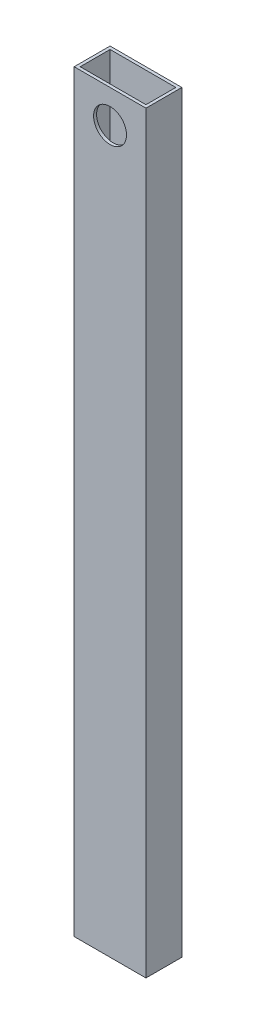
ISO-10303-21;
HEADER;
FILE_DESCRIPTION(('STEP AP214'),'2;1');
FILE_NAME('part.step','',(''),(''),'','','');
FILE_SCHEMA(('AUTOMOTIVE_DESIGN { 1 0 10303 214 1 1 1 1 }'));
ENDSEC;
DATA;
#1=APPLICATION_CONTEXT('core data for automotive mechanical design processes');
#2=APPLICATION_PROTOCOL_DEFINITION('international standard','automotive_design',2000,#1);
#3=PRODUCT_CONTEXT('',#1,'mechanical');
#4=PRODUCT('Part','Part','',(#3));
#5=PRODUCT_RELATED_PRODUCT_CATEGORY('part','',(#4));
#6=PRODUCT_DEFINITION_FORMATION('','',#4);
#7=PRODUCT_DEFINITION_CONTEXT('part definition',#1,'design');
#8=PRODUCT_DEFINITION('design','',#6,#7);
#9=PRODUCT_DEFINITION_SHAPE('','',#8);
#10=(LENGTH_UNIT() NAMED_UNIT(*) SI_UNIT(.MILLI.,.METRE.));
#11=(NAMED_UNIT(*) PLANE_ANGLE_UNIT() SI_UNIT($,.RADIAN.));
#12=(NAMED_UNIT(*) SI_UNIT($,.STERADIAN.) SOLID_ANGLE_UNIT());
#13=UNCERTAINTY_MEASURE_WITH_UNIT(LENGTH_MEASURE(1.E-05),#10,'distance_accuracy_value','');
#14=(GEOMETRIC_REPRESENTATION_CONTEXT(3) GLOBAL_UNCERTAINTY_ASSIGNED_CONTEXT((#13)) GLOBAL_UNIT_ASSIGNED_CONTEXT((#10,
#11,#12)) REPRESENTATION_CONTEXT('',''));
#15=CARTESIAN_POINT('',(0.,0.,0.));
#16=DIRECTION('',(0.,0.,1.));
#17=DIRECTION('',(1.,0.,0.));
#18=AXIS2_PLACEMENT_3D('',#15,#16,#17);
#19=CARTESIAN_POINT('',(38.1,-290.,-19.05));
#20=DIRECTION('',(1.,0.,0.));
#21=DIRECTION('',(0.,0.,-1.));
#22=AXIS2_PLACEMENT_3D('',#19,#20,#21);
#23=PLANE('',#22);
#24=DIRECTION('',(0.,1.,0.));
#25=VECTOR('',#24,1.);
#26=CARTESIAN_POINT('',(38.1,-290.,-19.05));
#27=LINE('',#26,#25);
#28=CARTESIAN_POINT('',(38.1,-290.,-19.05));
#29=VERTEX_POINT('',#28);
#30=CARTESIAN_POINT('',(38.1,510.,-19.05));
#31=VERTEX_POINT('',#30);
#32=EDGE_CURVE('E87',#29,#31,#27,.T.);
#33=ORIENTED_EDGE('',*,*,#32,.T.);
#34=DIRECTION('',(0.,0.,-1.));
#35=VECTOR('',#34,1.);
#36=CARTESIAN_POINT('',(38.1,510.,-19.05));
#37=LINE('',#36,#35);
#38=CARTESIAN_POINT('',(38.1,510.,19.05));
#39=VERTEX_POINT('',#38);
#40=EDGE_CURVE('E181',#39,#31,#37,.T.);
#41=ORIENTED_EDGE('',*,*,#40,.F.);
#42=DIRECTION('',(0.,1.,0.));
#43=VECTOR('',#42,1.);
#44=CARTESIAN_POINT('',(38.1,-290.,19.05));
#45=LINE('',#44,#43);
#46=CARTESIAN_POINT('',(38.1,-290.,19.05));
#47=VERTEX_POINT('',#46);
#48=EDGE_CURVE('E12',#47,#39,#45,.T.);
#49=ORIENTED_EDGE('',*,*,#48,.F.);
#50=DIRECTION('',(0.,0.,-1.));
#51=VECTOR('',#50,1.);
#52=CARTESIAN_POINT('',(38.1,-290.,-19.05));
#53=LINE('',#52,#51);
#54=EDGE_CURVE('E200',#47,#29,#53,.T.);
#55=ORIENTED_EDGE('',*,*,#54,.T.);
#56=EDGE_LOOP('',(#33,#41,#49,#55));
#57=FACE_BOUND('',#56,.T.);
#58=ADVANCED_FACE('F84',(#57),#23,.T.);
#59=CARTESIAN_POINT('',(-38.1,-290.,19.05));
#60=DIRECTION('',(0.,0.,1.));
#61=DIRECTION('',(1.,0.,0.));
#62=AXIS2_PLACEMENT_3D('',#59,#60,#61);
#63=PLANE('',#62);
#64=CARTESIAN_POINT('',(0.,475.,19.05));
#65=DIRECTION('',(0.,0.,1.));
#66=DIRECTION('',(1.,0.,0.));
#67=AXIS2_PLACEMENT_3D('',#64,#65,#66);
#68=CIRCLE('',#67,17.5);
#69=CARTESIAN_POINT('',(17.5,475.,19.05));
#70=VERTEX_POINT('',#69);
#71=EDGE_CURVE('E407',#70,#70,#68,.T.);
#72=ORIENTED_EDGE('',*,*,#71,.F.);
#73=EDGE_LOOP('',(#72));
#74=FACE_BOUND('',#73,.T.);
#75=ORIENTED_EDGE('',*,*,#48,.T.);
#76=DIRECTION('',(1.,0.,0.));
#77=VECTOR('',#76,1.);
#78=CARTESIAN_POINT('',(-38.1,510.,19.05));
#79=LINE('',#78,#77);
#80=CARTESIAN_POINT('',(-38.1,510.,19.05));
#81=VERTEX_POINT('',#80);
#82=EDGE_CURVE('E190',#81,#39,#79,.T.);
#83=ORIENTED_EDGE('',*,*,#82,.F.);
#84=DIRECTION('',(0.,1.,0.));
#85=VECTOR('',#84,1.);
#86=CARTESIAN_POINT('',(-38.1,-290.,19.05));
#87=LINE('',#86,#85);
#88=CARTESIAN_POINT('',(-38.1,-290.,19.05));
#89=VERTEX_POINT('',#88);
#90=EDGE_CURVE('E92',#89,#81,#87,.T.);
#91=ORIENTED_EDGE('',*,*,#90,.F.);
#92=DIRECTION('',(1.,0.,0.));
#93=VECTOR('',#92,1.);
#94=CARTESIAN_POINT('',(-38.1,-290.,19.05));
#95=LINE('',#94,#93);
#96=EDGE_CURVE('E211',#89,#47,#95,.T.);
#97=ORIENTED_EDGE('',*,*,#96,.T.);
#98=EDGE_LOOP('',(#75,#83,#91,#97));
#99=FACE_BOUND('',#98,.T.);
#100=ADVANCED_FACE('F223',(#74,#99),#63,.T.);
#101=CARTESIAN_POINT('',(-38.1,-290.,-19.05));
#102=DIRECTION('',(-1.,0.,0.));
#103=DIRECTION('',(0.,0.,1.));
#104=AXIS2_PLACEMENT_3D('',#101,#102,#103);
#105=PLANE('',#104);
#106=ORIENTED_EDGE('',*,*,#90,.T.);
#107=DIRECTION('',(0.,0.,1.));
#108=VECTOR('',#107,1.);
#109=CARTESIAN_POINT('',(-38.1,510.,-19.05));
#110=LINE('',#109,#108);
#111=CARTESIAN_POINT('',(-38.1,510.,-19.05));
#112=VERTEX_POINT('',#111);
#113=EDGE_CURVE('E187',#112,#81,#110,.T.);
#114=ORIENTED_EDGE('',*,*,#113,.F.);
#115=DIRECTION('',(0.,1.,0.));
#116=VECTOR('',#115,1.);
#117=CARTESIAN_POINT('',(-38.1,-290.,-19.05));
#118=LINE('',#117,#116);
#119=CARTESIAN_POINT('',(-38.1,-290.,-19.05));
#120=VERTEX_POINT('',#119);
#121=EDGE_CURVE('E214',#120,#112,#118,.T.);
#122=ORIENTED_EDGE('',*,*,#121,.F.);
#123=DIRECTION('',(0.,0.,1.));
#124=VECTOR('',#123,1.);
#125=CARTESIAN_POINT('',(-38.1,-290.,-19.05));
#126=LINE('',#125,#124);
#127=EDGE_CURVE('E208',#120,#89,#126,.T.);
#128=ORIENTED_EDGE('',*,*,#127,.T.);
#129=EDGE_LOOP('',(#106,#114,#122,#128));
#130=FACE_BOUND('',#129,.T.);
#131=ADVANCED_FACE('F229',(#130),#105,.T.);
#132=CARTESIAN_POINT('',(-38.1,-290.,-19.05));
#133=DIRECTION('',(0.,0.,-1.));
#134=DIRECTION('',(-1.,0.,0.));
#135=AXIS2_PLACEMENT_3D('',#132,#133,#134);
#136=PLANE('',#135);
#137=CARTESIAN_POINT('',(0.,-75.,-19.05));
#138=DIRECTION('',(0.,0.,-1.));
#139=DIRECTION('',(-1.,0.,0.));
#140=AXIS2_PLACEMENT_3D('',#137,#138,#139);
#141=CIRCLE('',#140,17.5);
#142=CARTESIAN_POINT('',(-17.5,-75.,-19.05));
#143=VERTEX_POINT('',#142);
#144=EDGE_CURVE('E410',#143,#143,#141,.T.);
#145=ORIENTED_EDGE('',*,*,#144,.F.);
#146=EDGE_LOOP('',(#145));
#147=FACE_BOUND('',#146,.T.);
#148=CARTESIAN_POINT('',(20.,-25.,-19.05));
#149=DIRECTION('',(0.,0.,-1.));
#150=DIRECTION('',(-1.,0.,0.));
#151=AXIS2_PLACEMENT_3D('',#148,#149,#150);
#152=CIRCLE('',#151,6.);
#153=CARTESIAN_POINT('',(14.,-25.,-19.05));
#154=VERTEX_POINT('',#153);
#155=EDGE_CURVE('E401',#154,#154,#152,.T.);
#156=ORIENTED_EDGE('',*,*,#155,.F.);
#157=EDGE_LOOP('',(#156));
#158=FACE_BOUND('',#157,.T.);
#159=CARTESIAN_POINT('',(-20.,-275.,-19.05));
#160=DIRECTION('',(0.,0.,-1.));
#161=DIRECTION('',(-1.,0.,0.));
#162=AXIS2_PLACEMENT_3D('',#159,#160,#161);
#163=CIRCLE('',#162,6.);
#164=CARTESIAN_POINT('',(-26.,-275.,-19.05));
#165=VERTEX_POINT('',#164);
#166=EDGE_CURVE('E395',#165,#165,#163,.T.);
#167=ORIENTED_EDGE('',*,*,#166,.F.);
#168=EDGE_LOOP('',(#167));
#169=FACE_BOUND('',#168,.T.);
#170=CARTESIAN_POINT('',(20.,-275.,-19.05));
#171=DIRECTION('',(0.,0.,-1.));
#172=DIRECTION('',(-1.,0.,0.));
#173=AXIS2_PLACEMENT_3D('',#170,#171,#172);
#174=CIRCLE('',#173,6.);
#175=CARTESIAN_POINT('',(14.,-275.,-19.05));
#176=VERTEX_POINT('',#175);
#177=EDGE_CURVE('E387',#176,#176,#174,.T.);
#178=ORIENTED_EDGE('',*,*,#177,.F.);
#179=EDGE_LOOP('',(#178));
#180=FACE_BOUND('',#179,.T.);
#181=CARTESIAN_POINT('',(-20.,-25.,-19.05));
#182=DIRECTION('',(0.,0.,-1.));
#183=DIRECTION('',(-1.,0.,0.));
#184=AXIS2_PLACEMENT_3D('',#181,#182,#183);
#185=CIRCLE('',#184,6.);
#186=CARTESIAN_POINT('',(-26.,-25.,-19.05));
#187=VERTEX_POINT('',#186);
#188=EDGE_CURVE('E382',#187,#187,#185,.T.);
#189=ORIENTED_EDGE('',*,*,#188,.F.);
#190=EDGE_LOOP('',(#189));
#191=FACE_BOUND('',#190,.T.);
#192=ORIENTED_EDGE('',*,*,#121,.T.);
#193=DIRECTION('',(-1.,0.,0.));
#194=VECTOR('',#193,1.);
#195=CARTESIAN_POINT('',(-38.1,510.,-19.05));
#196=LINE('',#195,#194);
#197=EDGE_CURVE('E184',#31,#112,#196,.T.);
#198=ORIENTED_EDGE('',*,*,#197,.F.);
#199=ORIENTED_EDGE('',*,*,#32,.F.);
#200=DIRECTION('',(-1.,0.,0.));
#201=VECTOR('',#200,1.);
#202=CARTESIAN_POINT('',(-38.1,-290.,-19.05));
#203=LINE('',#202,#201);
#204=EDGE_CURVE('E205',#29,#120,#203,.T.);
#205=ORIENTED_EDGE('',*,*,#204,.T.);
#206=EDGE_LOOP('',(#192,#198,#199,#205));
#207=FACE_BOUND('',#206,.T.);
#208=ADVANCED_FACE('F218',(#147,#158,#169,#180,#191,#207),#136,.T.);
#209=CARTESIAN_POINT('',(0.,-290.,0.));
#210=DIRECTION('',(0.,1.,0.));
#211=DIRECTION('',(0.,0.,1.));
#212=AXIS2_PLACEMENT_3D('',#209,#210,#211);
#213=PLANE('',#212);
#214=DIRECTION('',(1.,0.,0.));
#215=VECTOR('',#214,1.);
#216=CARTESIAN_POINT('',(-38.1,-290.,15.875));
#217=LINE('',#216,#215);
#218=CARTESIAN_POINT('',(-34.925,-290.,15.875));
#219=VERTEX_POINT('',#218);
#220=CARTESIAN_POINT('',(34.925,-290.,15.875));
#221=VERTEX_POINT('',#220);
#222=EDGE_CURVE('E161',#219,#221,#217,.T.);
#223=ORIENTED_EDGE('',*,*,#222,.T.);
#224=DIRECTION('',(0.,0.,-1.));
#225=VECTOR('',#224,1.);
#226=CARTESIAN_POINT('',(34.925,-290.,-19.05));
#227=LINE('',#226,#225);
#228=CARTESIAN_POINT('',(34.925,-290.,-15.875));
#229=VERTEX_POINT('',#228);
#230=EDGE_CURVE('E193',#221,#229,#227,.T.);
#231=ORIENTED_EDGE('',*,*,#230,.T.);
#232=DIRECTION('',(-1.,0.,0.));
#233=VECTOR('',#232,1.);
#234=CARTESIAN_POINT('',(-38.1,-290.,-15.875));
#235=LINE('',#234,#233);
#236=CARTESIAN_POINT('',(-34.925,-290.,-15.875));
#237=VERTEX_POINT('',#236);
#238=EDGE_CURVE('E156',#229,#237,#235,.T.);
#239=ORIENTED_EDGE('',*,*,#238,.T.);
#240=DIRECTION('',(0.,0.,1.));
#241=VECTOR('',#240,1.);
#242=CARTESIAN_POINT('',(-34.925,-290.,-19.05));
#243=LINE('',#242,#241);
#244=EDGE_CURVE('E100',#237,#219,#243,.T.);
#245=ORIENTED_EDGE('',*,*,#244,.T.);
#246=EDGE_LOOP('',(#223,#231,#239,#245));
#247=FACE_BOUND('',#246,.T.);
#248=ORIENTED_EDGE('',*,*,#54,.F.);
#249=ORIENTED_EDGE('',*,*,#96,.F.);
#250=ORIENTED_EDGE('',*,*,#127,.F.);
#251=ORIENTED_EDGE('',*,*,#204,.F.);
#252=EDGE_LOOP('',(#248,#249,#250,#251));
#253=FACE_BOUND('',#252,.T.);
#254=ADVANCED_FACE('F227',(#247,#253),#213,.F.);
#255=CARTESIAN_POINT('',(34.925,-290.,-19.05));
#256=DIRECTION('',(1.,0.,0.));
#257=DIRECTION('',(0.,0.,-1.));
#258=AXIS2_PLACEMENT_3D('',#255,#256,#257);
#259=PLANE('',#258);
#260=DIRECTION('',(0.,1.,0.));
#261=VECTOR('',#260,1.);
#262=CARTESIAN_POINT('',(34.925,-290.,15.875));
#263=LINE('',#262,#261);
#264=CARTESIAN_POINT('',(34.925,510.,15.875));
#265=VERTEX_POINT('',#264);
#266=EDGE_CURVE('E166',#221,#265,#263,.T.);
#267=ORIENTED_EDGE('',*,*,#266,.T.);
#268=DIRECTION('',(0.,0.,-1.));
#269=VECTOR('',#268,1.);
#270=CARTESIAN_POINT('',(34.925,510.,-19.05));
#271=LINE('',#270,#269);
#272=CARTESIAN_POINT('',(34.925,510.,-15.875));
#273=VERTEX_POINT('',#272);
#274=EDGE_CURVE('E164',#265,#273,#271,.T.);
#275=ORIENTED_EDGE('',*,*,#274,.T.);
#276=DIRECTION('',(0.,1.,0.));
#277=VECTOR('',#276,1.);
#278=CARTESIAN_POINT('',(34.925,-290.,-15.875));
#279=LINE('',#278,#277);
#280=EDGE_CURVE('E149',#229,#273,#279,.T.);
#281=ORIENTED_EDGE('',*,*,#280,.F.);
#282=ORIENTED_EDGE('',*,*,#230,.F.);
#283=EDGE_LOOP('',(#267,#275,#281,#282));
#284=FACE_BOUND('',#283,.T.);
#285=ADVANCED_FACE('F165',(#284),#259,.F.);
#286=CARTESIAN_POINT('',(-38.1,-290.,15.875));
#287=DIRECTION('',(0.,0.,1.));
#288=DIRECTION('',(1.,0.,0.));
#289=AXIS2_PLACEMENT_3D('',#286,#287,#288);
#290=PLANE('',#289);
#291=CARTESIAN_POINT('',(0.,475.,15.875));
#292=DIRECTION('',(0.,0.,1.));
#293=DIRECTION('',(1.,0.,0.));
#294=AXIS2_PLACEMENT_3D('',#291,#292,#293);
#295=CIRCLE('',#294,17.5);
#296=CARTESIAN_POINT('',(17.5,475.,15.875));
#297=VERTEX_POINT('',#296);
#298=EDGE_CURVE('E404',#297,#297,#295,.F.);
#299=ORIENTED_EDGE('',*,*,#298,.F.);
#300=EDGE_LOOP('',(#299));
#301=FACE_BOUND('',#300,.T.);
#302=DIRECTION('',(0.,1.,0.));
#303=VECTOR('',#302,1.);
#304=CARTESIAN_POINT('',(-34.925,-290.,15.875));
#305=LINE('',#304,#303);
#306=CARTESIAN_POINT('',(-34.925,510.,15.875));
#307=VERTEX_POINT('',#306);
#308=EDGE_CURVE('E201',#219,#307,#305,.T.);
#309=ORIENTED_EDGE('',*,*,#308,.T.);
#310=DIRECTION('',(1.,0.,0.));
#311=VECTOR('',#310,1.);
#312=CARTESIAN_POINT('',(-38.1,510.,15.875));
#313=LINE('',#312,#311);
#314=EDGE_CURVE('E176',#307,#265,#313,.T.);
#315=ORIENTED_EDGE('',*,*,#314,.T.);
#316=ORIENTED_EDGE('',*,*,#266,.F.);
#317=ORIENTED_EDGE('',*,*,#222,.F.);
#318=EDGE_LOOP('',(#309,#315,#316,#317));
#319=FACE_BOUND('',#318,.T.);
#320=ADVANCED_FACE('F258',(#301,#319),#290,.F.);
#321=CARTESIAN_POINT('',(-34.925,-290.,-19.05));
#322=DIRECTION('',(-1.,0.,0.));
#323=DIRECTION('',(0.,0.,1.));
#324=AXIS2_PLACEMENT_3D('',#321,#322,#323);
#325=PLANE('',#324);
#326=DIRECTION('',(0.,1.,0.));
#327=VECTOR('',#326,1.);
#328=CARTESIAN_POINT('',(-34.925,-290.,-15.875));
#329=LINE('',#328,#327);
#330=CARTESIAN_POINT('',(-34.925,510.,-15.875));
#331=VERTEX_POINT('',#330);
#332=EDGE_CURVE('E160',#237,#331,#329,.T.);
#333=ORIENTED_EDGE('',*,*,#332,.T.);
#334=DIRECTION('',(0.,0.,1.));
#335=VECTOR('',#334,1.);
#336=CARTESIAN_POINT('',(-34.925,510.,-19.05));
#337=LINE('',#336,#335);
#338=EDGE_CURVE('E174',#331,#307,#337,.T.);
#339=ORIENTED_EDGE('',*,*,#338,.T.);
#340=ORIENTED_EDGE('',*,*,#308,.F.);
#341=ORIENTED_EDGE('',*,*,#244,.F.);
#342=EDGE_LOOP('',(#333,#339,#340,#341));
#343=FACE_BOUND('',#342,.T.);
#344=ADVANCED_FACE('F263',(#343),#325,.F.);
#345=CARTESIAN_POINT('',(-38.1,-290.,-15.875));
#346=DIRECTION('',(0.,0.,-1.));
#347=DIRECTION('',(-1.,0.,0.));
#348=AXIS2_PLACEMENT_3D('',#345,#346,#347);
#349=PLANE('',#348);
#350=CARTESIAN_POINT('',(0.,-75.,-15.875));
#351=DIRECTION('',(0.,0.,-1.));
#352=DIRECTION('',(-1.,0.,0.));
#353=AXIS2_PLACEMENT_3D('',#350,#351,#352);
#354=CIRCLE('',#353,17.5);
#355=CARTESIAN_POINT('',(-17.5,-75.,-15.875));
#356=VERTEX_POINT('',#355);
#357=EDGE_CURVE('E412',#356,#356,#354,.F.);
#358=ORIENTED_EDGE('',*,*,#357,.F.);
#359=EDGE_LOOP('',(#358));
#360=FACE_BOUND('',#359,.T.);
#361=CARTESIAN_POINT('',(20.,-25.,-15.875));
#362=DIRECTION('',(0.,0.,-1.));
#363=DIRECTION('',(-1.,0.,0.));
#364=AXIS2_PLACEMENT_3D('',#361,#362,#363);
#365=CIRCLE('',#364,6.);
#366=CARTESIAN_POINT('',(14.,-25.,-15.875));
#367=VERTEX_POINT('',#366);
#368=EDGE_CURVE('E398',#367,#367,#365,.T.);
#369=ORIENTED_EDGE('',*,*,#368,.T.);
#370=EDGE_LOOP('',(#369));
#371=FACE_BOUND('',#370,.T.);
#372=CARTESIAN_POINT('',(-20.,-275.,-15.875));
#373=DIRECTION('',(0.,0.,-1.));
#374=DIRECTION('',(-1.,0.,0.));
#375=AXIS2_PLACEMENT_3D('',#372,#373,#374);
#376=CIRCLE('',#375,6.);
#377=CARTESIAN_POINT('',(-26.,-275.,-15.875));
#378=VERTEX_POINT('',#377);
#379=EDGE_CURVE('E392',#378,#378,#376,.T.);
#380=ORIENTED_EDGE('',*,*,#379,.T.);
#381=EDGE_LOOP('',(#380));
#382=FACE_BOUND('',#381,.T.);
#383=CARTESIAN_POINT('',(20.,-275.,-15.875));
#384=DIRECTION('',(0.,0.,-1.));
#385=DIRECTION('',(-1.,0.,0.));
#386=AXIS2_PLACEMENT_3D('',#383,#384,#385);
#387=CIRCLE('',#386,6.);
#388=CARTESIAN_POINT('',(14.,-275.,-15.875));
#389=VERTEX_POINT('',#388);
#390=EDGE_CURVE('E384',#389,#389,#387,.T.);
#391=ORIENTED_EDGE('',*,*,#390,.T.);
#392=EDGE_LOOP('',(#391));
#393=FACE_BOUND('',#392,.T.);
#394=CARTESIAN_POINT('',(-20.,-25.,-15.875));
#395=DIRECTION('',(0.,0.,-1.));
#396=DIRECTION('',(-1.,0.,0.));
#397=AXIS2_PLACEMENT_3D('',#394,#395,#396);
#398=CIRCLE('',#397,6.);
#399=CARTESIAN_POINT('',(-26.,-25.,-15.875));
#400=VERTEX_POINT('',#399);
#401=EDGE_CURVE('E170',#400,#400,#398,.T.);
#402=ORIENTED_EDGE('',*,*,#401,.T.);
#403=EDGE_LOOP('',(#402));
#404=FACE_BOUND('',#403,.T.);
#405=ORIENTED_EDGE('',*,*,#280,.T.);
#406=DIRECTION('',(-1.,0.,0.));
#407=VECTOR('',#406,1.);
#408=CARTESIAN_POINT('',(-38.1,510.,-15.875));
#409=LINE('',#408,#407);
#410=EDGE_CURVE('E153',#273,#331,#409,.T.);
#411=ORIENTED_EDGE('',*,*,#410,.T.);
#412=ORIENTED_EDGE('',*,*,#332,.F.);
#413=ORIENTED_EDGE('',*,*,#238,.F.);
#414=EDGE_LOOP('',(#405,#411,#412,#413));
#415=FACE_BOUND('',#414,.T.);
#416=ADVANCED_FACE('F151',(#360,#371,#382,#393,#404,#415),#349,.F.);
#417=CARTESIAN_POINT('',(0.,510.,0.));
#418=DIRECTION('',(0.,1.,0.));
#419=DIRECTION('',(0.,0.,1.));
#420=AXIS2_PLACEMENT_3D('',#417,#418,#419);
#421=PLANE('',#420);
#422=ORIENTED_EDGE('',*,*,#40,.T.);
#423=ORIENTED_EDGE('',*,*,#197,.T.);
#424=ORIENTED_EDGE('',*,*,#113,.T.);
#425=ORIENTED_EDGE('',*,*,#82,.T.);
#426=EDGE_LOOP('',(#422,#423,#424,#425));
#427=FACE_BOUND('',#426,.T.);
#428=ORIENTED_EDGE('',*,*,#410,.F.);
#429=ORIENTED_EDGE('',*,*,#274,.F.);
#430=ORIENTED_EDGE('',*,*,#314,.F.);
#431=ORIENTED_EDGE('',*,*,#338,.F.);
#432=EDGE_LOOP('',(#428,#429,#430,#431));
#433=FACE_BOUND('',#432,.T.);
#434=ADVANCED_FACE('F172',(#427,#433),#421,.T.);
#435=CARTESIAN_POINT('',(-20.,-25.,-19.05));
#436=DIRECTION('',(0.,0.,-1.));
#437=DIRECTION('',(-1.,0.,0.));
#438=AXIS2_PLACEMENT_3D('',#435,#436,#437);
#439=CYLINDRICAL_SURFACE('',#438,6.);
#440=ORIENTED_EDGE('',*,*,#401,.F.);
#441=EDGE_LOOP('',(#440));
#442=FACE_BOUND('',#441,.T.);
#443=ORIENTED_EDGE('',*,*,#188,.T.);
#444=EDGE_LOOP('',(#443));
#445=FACE_BOUND('',#444,.T.);
#446=ADVANCED_FACE('F323',(#442,#445),#439,.F.);
#447=CARTESIAN_POINT('',(20.,-275.,-19.05));
#448=DIRECTION('',(0.,0.,-1.));
#449=DIRECTION('',(-1.,0.,0.));
#450=AXIS2_PLACEMENT_3D('',#447,#448,#449);
#451=CYLINDRICAL_SURFACE('',#450,6.);
#452=ORIENTED_EDGE('',*,*,#390,.F.);
#453=EDGE_LOOP('',(#452));
#454=FACE_BOUND('',#453,.T.);
#455=ORIENTED_EDGE('',*,*,#177,.T.);
#456=EDGE_LOOP('',(#455));
#457=FACE_BOUND('',#456,.T.);
#458=ADVANCED_FACE('F319',(#454,#457),#451,.F.);
#459=CARTESIAN_POINT('',(-20.,-275.,-19.05));
#460=DIRECTION('',(0.,0.,-1.));
#461=DIRECTION('',(-1.,0.,0.));
#462=AXIS2_PLACEMENT_3D('',#459,#460,#461);
#463=CYLINDRICAL_SURFACE('',#462,6.);
#464=ORIENTED_EDGE('',*,*,#379,.F.);
#465=EDGE_LOOP('',(#464));
#466=FACE_BOUND('',#465,.T.);
#467=ORIENTED_EDGE('',*,*,#166,.T.);
#468=EDGE_LOOP('',(#467));
#469=FACE_BOUND('',#468,.T.);
#470=ADVANCED_FACE('F315',(#466,#469),#463,.F.);
#471=CARTESIAN_POINT('',(20.,-25.,-19.05));
#472=DIRECTION('',(0.,0.,-1.));
#473=DIRECTION('',(-1.,0.,0.));
#474=AXIS2_PLACEMENT_3D('',#471,#472,#473);
#475=CYLINDRICAL_SURFACE('',#474,6.);
#476=ORIENTED_EDGE('',*,*,#368,.F.);
#477=EDGE_LOOP('',(#476));
#478=FACE_BOUND('',#477,.T.);
#479=ORIENTED_EDGE('',*,*,#155,.T.);
#480=EDGE_LOOP('',(#479));
#481=FACE_BOUND('',#480,.T.);
#482=ADVANCED_FACE('F253',(#478,#481),#475,.F.);
#483=CARTESIAN_POINT('',(0.,475.,-19.051));
#484=DIRECTION('',(0.,0.,1.));
#485=DIRECTION('',(1.,0.,0.));
#486=AXIS2_PLACEMENT_3D('',#483,#484,#485);
#487=CYLINDRICAL_SURFACE('',#486,17.5);
#488=ORIENTED_EDGE('',*,*,#71,.T.);
#489=EDGE_LOOP('',(#488));
#490=FACE_BOUND('',#489,.T.);
#491=ORIENTED_EDGE('',*,*,#298,.T.);
#492=EDGE_LOOP('',(#491));
#493=FACE_BOUND('',#492,.T.);
#494=ADVANCED_FACE('F273',(#490,#493),#487,.F.);
#495=CARTESIAN_POINT('',(0.,-75.,19.051));
#496=DIRECTION('',(0.,0.,-1.));
#497=DIRECTION('',(-1.,0.,0.));
#498=AXIS2_PLACEMENT_3D('',#495,#496,#497);
#499=CYLINDRICAL_SURFACE('',#498,17.5);
#500=ORIENTED_EDGE('',*,*,#144,.T.);
#501=EDGE_LOOP('',(#500));
#502=FACE_BOUND('',#501,.T.);
#503=ORIENTED_EDGE('',*,*,#357,.T.);
#504=EDGE_LOOP('',(#503));
#505=FACE_BOUND('',#504,.T.);
#506=ADVANCED_FACE('F278',(#502,#505),#499,.F.);
#507=CLOSED_SHELL('',(#58,#100,#131,#208,#254,#285,#320,#344,#416,#434,#446,#458,#470,#482,#494,#506));
#508=MANIFOLD_SOLID_BREP('B2',#507);
#509=ADVANCED_BREP_SHAPE_REPRESENTATION('',(#18,#508),#14);
#510=SHAPE_DEFINITION_REPRESENTATION(#9,#509);
ENDSEC;
END-ISO-10303-21;
